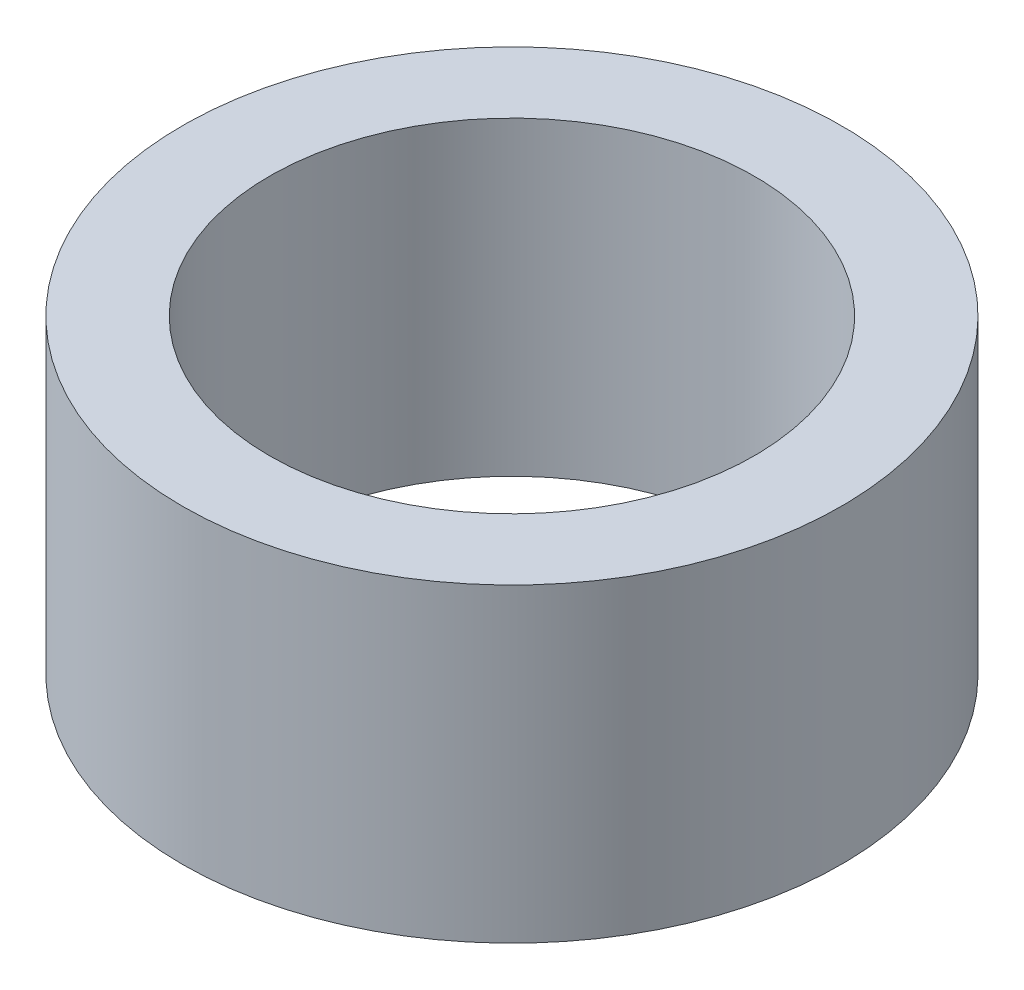
ISO-10303-21;
HEADER;
FILE_DESCRIPTION(('STEP AP214'),'2;1');
FILE_NAME('part.step','',(''),(''),'','','');
FILE_SCHEMA(('AUTOMOTIVE_DESIGN { 1 0 10303 214 1 1 1 1 }'));
ENDSEC;
DATA;
#1=APPLICATION_CONTEXT('core data for automotive mechanical design processes');
#2=APPLICATION_PROTOCOL_DEFINITION('international standard','automotive_design',2000,#1);
#3=PRODUCT_CONTEXT('',#1,'mechanical');
#4=PRODUCT('Part','Part','',(#3));
#5=PRODUCT_RELATED_PRODUCT_CATEGORY('part','',(#4));
#6=PRODUCT_DEFINITION_FORMATION('','',#4);
#7=PRODUCT_DEFINITION_CONTEXT('part definition',#1,'design');
#8=PRODUCT_DEFINITION('design','',#6,#7);
#9=PRODUCT_DEFINITION_SHAPE('','',#8);
#10=(LENGTH_UNIT() NAMED_UNIT(*) SI_UNIT(.MILLI.,.METRE.));
#11=(NAMED_UNIT(*) PLANE_ANGLE_UNIT() SI_UNIT($,.RADIAN.));
#12=(NAMED_UNIT(*) SI_UNIT($,.STERADIAN.) SOLID_ANGLE_UNIT());
#13=UNCERTAINTY_MEASURE_WITH_UNIT(LENGTH_MEASURE(1.E-05),#10,'distance_accuracy_value','');
#14=(GEOMETRIC_REPRESENTATION_CONTEXT(3) GLOBAL_UNCERTAINTY_ASSIGNED_CONTEXT((#13)) GLOBAL_UNIT_ASSIGNED_CONTEXT((#10,
#11,#12)) REPRESENTATION_CONTEXT('',''));
#15=CARTESIAN_POINT('',(0.,0.,0.));
#16=DIRECTION('',(0.,0.,1.));
#17=DIRECTION('',(1.,0.,0.));
#18=AXIS2_PLACEMENT_3D('',#15,#16,#17);
#19=CARTESIAN_POINT('',(0.,4.,0.));
#20=DIRECTION('',(0.,1.,0.));
#21=DIRECTION('',(0.,0.,1.));
#22=AXIS2_PLACEMENT_3D('',#19,#20,#21);
#23=PLANE('',#22);
#24=CARTESIAN_POINT('',(0.,4.,0.));
#25=DIRECTION('',(0.,1.,0.));
#26=DIRECTION('',(0.,0.,1.));
#27=AXIS2_PLACEMENT_3D('',#24,#25,#26);
#28=CIRCLE('',#27,4.25);
#29=CARTESIAN_POINT('',(0.,4.,4.25));
#30=VERTEX_POINT('',#29);
#31=EDGE_CURVE('E10',#30,#30,#28,.T.);
#32=ORIENTED_EDGE('',*,*,#31,.T.);
#33=EDGE_LOOP('',(#32));
#34=FACE_BOUND('',#33,.T.);
#35=CARTESIAN_POINT('',(0.,4.,0.));
#36=DIRECTION('',(0.,1.,0.));
#37=DIRECTION('',(0.,0.,1.));
#38=AXIS2_PLACEMENT_3D('',#35,#36,#37);
#39=CIRCLE('',#38,3.125);
#40=CARTESIAN_POINT('',(0.,4.,3.125));
#41=VERTEX_POINT('',#40);
#42=EDGE_CURVE('E56',#41,#41,#39,.T.);
#43=ORIENTED_EDGE('',*,*,#42,.F.);
#44=EDGE_LOOP('',(#43));
#45=FACE_BOUND('',#44,.T.);
#46=ADVANCED_FACE('F43',(#34,#45),#23,.T.);
#47=CARTESIAN_POINT('',(0.,0.,0.));
#48=DIRECTION('',(0.,1.,0.));
#49=DIRECTION('',(0.,0.,1.));
#50=AXIS2_PLACEMENT_3D('',#47,#48,#49);
#51=PLANE('',#50);
#52=CARTESIAN_POINT('',(0.,0.,0.));
#53=DIRECTION('',(0.,1.,0.));
#54=DIRECTION('',(0.,0.,1.));
#55=AXIS2_PLACEMENT_3D('',#52,#53,#54);
#56=CIRCLE('',#55,4.25);
#57=CARTESIAN_POINT('',(0.,0.,4.25));
#58=VERTEX_POINT('',#57);
#59=EDGE_CURVE('E47',#58,#58,#56,.T.);
#60=ORIENTED_EDGE('',*,*,#59,.F.);
#61=EDGE_LOOP('',(#60));
#62=FACE_BOUND('',#61,.T.);
#63=CARTESIAN_POINT('',(0.,0.,0.));
#64=DIRECTION('',(0.,1.,0.));
#65=DIRECTION('',(0.,0.,1.));
#66=AXIS2_PLACEMENT_3D('',#63,#64,#65);
#67=CIRCLE('',#66,3.125);
#68=CARTESIAN_POINT('',(0.,0.,3.125));
#69=VERTEX_POINT('',#68);
#70=EDGE_CURVE('E58',#69,#69,#67,.T.);
#71=ORIENTED_EDGE('',*,*,#70,.T.);
#72=EDGE_LOOP('',(#71));
#73=FACE_BOUND('',#72,.T.);
#74=ADVANCED_FACE('F70',(#62,#73),#51,.F.);
#75=CARTESIAN_POINT('',(0.,4.,0.));
#76=DIRECTION('',(0.,-1.,0.));
#77=DIRECTION('',(0.,0.,-1.));
#78=AXIS2_PLACEMENT_3D('',#75,#76,#77);
#79=CYLINDRICAL_SURFACE('',#78,4.25);
#80=ORIENTED_EDGE('',*,*,#31,.F.);
#81=EDGE_LOOP('',(#80));
#82=FACE_BOUND('',#81,.T.);
#83=ORIENTED_EDGE('',*,*,#59,.T.);
#84=EDGE_LOOP('',(#83));
#85=FACE_BOUND('',#84,.T.);
#86=ADVANCED_FACE('F45',(#82,#85),#79,.T.);
#87=CARTESIAN_POINT('',(0.,4.,0.));
#88=DIRECTION('',(0.,-1.,0.));
#89=DIRECTION('',(0.,0.,-1.));
#90=AXIS2_PLACEMENT_3D('',#87,#88,#89);
#91=CYLINDRICAL_SURFACE('',#90,3.125);
#92=ORIENTED_EDGE('',*,*,#42,.T.);
#93=EDGE_LOOP('',(#92));
#94=FACE_BOUND('',#93,.T.);
#95=ORIENTED_EDGE('',*,*,#70,.F.);
#96=EDGE_LOOP('',(#95));
#97=FACE_BOUND('',#96,.T.);
#98=ADVANCED_FACE('F66',(#94,#97),#91,.F.);
#99=CLOSED_SHELL('',(#46,#74,#86,#98));
#100=MANIFOLD_SOLID_BREP('B2',#99);
#101=ADVANCED_BREP_SHAPE_REPRESENTATION('',(#18,#100),#14);
#102=SHAPE_DEFINITION_REPRESENTATION(#9,#101);
ENDSEC;
END-ISO-10303-21;
